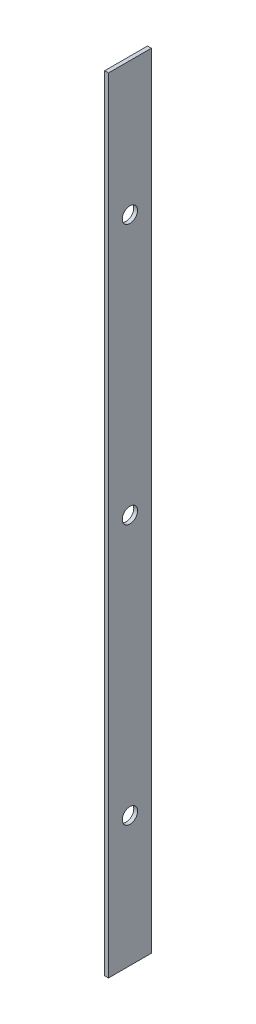
ISO-10303-21;
HEADER;
FILE_DESCRIPTION(('STEP AP214'),'2;1');
FILE_NAME('part.step','',(''),(''),'','','');
FILE_SCHEMA(('AUTOMOTIVE_DESIGN { 1 0 10303 214 1 1 1 1 }'));
ENDSEC;
DATA;
#1=APPLICATION_CONTEXT('core data for automotive mechanical design processes');
#2=APPLICATION_PROTOCOL_DEFINITION('international standard','automotive_design',2000,#1);
#3=PRODUCT_CONTEXT('',#1,'mechanical');
#4=PRODUCT('Part','Part','',(#3));
#5=PRODUCT_RELATED_PRODUCT_CATEGORY('part','',(#4));
#6=PRODUCT_DEFINITION_FORMATION('','',#4);
#7=PRODUCT_DEFINITION_CONTEXT('part definition',#1,'design');
#8=PRODUCT_DEFINITION('design','',#6,#7);
#9=PRODUCT_DEFINITION_SHAPE('','',#8);
#10=(LENGTH_UNIT() NAMED_UNIT(*) SI_UNIT(.MILLI.,.METRE.));
#11=(NAMED_UNIT(*) PLANE_ANGLE_UNIT() SI_UNIT($,.RADIAN.));
#12=(NAMED_UNIT(*) SI_UNIT($,.STERADIAN.) SOLID_ANGLE_UNIT());
#13=UNCERTAINTY_MEASURE_WITH_UNIT(LENGTH_MEASURE(1.E-05),#10,'distance_accuracy_value','');
#14=(GEOMETRIC_REPRESENTATION_CONTEXT(3) GLOBAL_UNCERTAINTY_ASSIGNED_CONTEXT((#13)) GLOBAL_UNIT_ASSIGNED_CONTEXT((#10,
#11,#12)) REPRESENTATION_CONTEXT('',''));
#15=CARTESIAN_POINT('',(0.,0.,0.));
#16=DIRECTION('',(0.,0.,1.));
#17=DIRECTION('',(1.,0.,0.));
#18=AXIS2_PLACEMENT_3D('',#15,#16,#17);
#19=CARTESIAN_POINT('',(1.5,0.,0.));
#20=DIRECTION('',(1.,0.,0.));
#21=DIRECTION('',(0.,0.,-1.));
#22=AXIS2_PLACEMENT_3D('',#19,#20,#21);
#23=PLANE('',#22);
#24=CARTESIAN_POINT('',(1.5,-7.74604075699193,16.5365200797255));
#25=DIRECTION('',(1.,0.,0.));
#26=DIRECTION('',(0.,0.,-1.));
#27=AXIS2_PLACEMENT_3D('',#24,#25,#26);
#28=CIRCLE('',#27,3.);
#29=CARTESIAN_POINT('',(1.5,-7.74604075699193,13.5365200797255));
#30=VERTEX_POINT('',#29);
#31=EDGE_CURVE('E122',#30,#30,#28,.T.);
#32=ORIENTED_EDGE('',*,*,#31,.F.);
#33=EDGE_LOOP('',(#32));
#34=FACE_BOUND('',#33,.T.);
#35=DIRECTION('',(0.,-1.,0.));
#36=VECTOR('',#35,1.);
#37=CARTESIAN_POINT('',(1.5,145.963612461817,24.8935200797206));
#38=LINE('',#37,#36);
#39=CARTESIAN_POINT('',(1.5,145.963612461817,24.8935200797206));
#40=VERTEX_POINT('',#39);
#41=CARTESIAN_POINT('',(1.5,-160.146040756996,24.8935200797208));
#42=VERTEX_POINT('',#41);
#43=EDGE_CURVE('E92',#40,#42,#38,.T.);
#44=ORIENTED_EDGE('',*,*,#43,.T.);
#45=DIRECTION('',(0.,0.,-1.));
#46=VECTOR('',#45,1.);
#47=CARTESIAN_POINT('',(1.5,-160.146040756996,24.8935200797208));
#48=LINE('',#47,#46);
#49=CARTESIAN_POINT('',(1.5,-160.146040756996,8.17952007972079));
#50=VERTEX_POINT('',#49);
#51=EDGE_CURVE('E87',#42,#50,#48,.T.);
#52=ORIENTED_EDGE('',*,*,#51,.T.);
#53=DIRECTION('',(0.,1.,0.));
#54=VECTOR('',#53,1.);
#55=CARTESIAN_POINT('',(1.5,-160.146040756996,8.17952007972079));
#56=LINE('',#55,#54);
#57=CARTESIAN_POINT('',(1.5,145.963612461817,8.17952007972055));
#58=VERTEX_POINT('',#57);
#59=EDGE_CURVE('E90',#50,#58,#56,.T.);
#60=ORIENTED_EDGE('',*,*,#59,.T.);
#61=DIRECTION('',(0.,0.,1.));
#62=VECTOR('',#61,1.);
#63=CARTESIAN_POINT('',(1.5,145.963612461817,8.17952007972055));
#64=LINE('',#63,#62);
#65=EDGE_CURVE('E57',#58,#40,#64,.T.);
#66=ORIENTED_EDGE('',*,*,#65,.T.);
#67=EDGE_LOOP('',(#44,#52,#60,#66));
#68=FACE_BOUND('',#67,.T.);
#69=CARTESIAN_POINT('',(1.5,93.8539592430032,16.5365200797248));
#70=DIRECTION('',(1.,0.,0.));
#71=DIRECTION('',(0.,0.,-1.));
#72=AXIS2_PLACEMENT_3D('',#69,#70,#71);
#73=CIRCLE('',#72,3.);
#74=CARTESIAN_POINT('',(1.5,93.8539592430032,13.5365200797248));
#75=VERTEX_POINT('',#74);
#76=EDGE_CURVE('E107',#75,#75,#73,.T.);
#77=ORIENTED_EDGE('',*,*,#76,.F.);
#78=EDGE_LOOP('',(#77));
#79=FACE_BOUND('',#78,.T.);
#80=CARTESIAN_POINT('',(1.5,-109.346040756997,16.5365200797244));
#81=DIRECTION('',(1.,0.,0.));
#82=DIRECTION('',(0.,0.,-1.));
#83=AXIS2_PLACEMENT_3D('',#80,#81,#82);
#84=CIRCLE('',#83,3.);
#85=CARTESIAN_POINT('',(1.5,-109.346040756997,13.5365200797244));
#86=VERTEX_POINT('',#85);
#87=EDGE_CURVE('E128',#86,#86,#84,.T.);
#88=ORIENTED_EDGE('',*,*,#87,.F.);
#89=EDGE_LOOP('',(#88));
#90=FACE_BOUND('',#89,.T.);
#91=ADVANCED_FACE('F40',(#34,#68,#79,#90),#23,.T.);
#92=CARTESIAN_POINT('',(0.,0.,0.));
#93=DIRECTION('',(1.,0.,0.));
#94=DIRECTION('',(0.,0.,-1.));
#95=AXIS2_PLACEMENT_3D('',#92,#93,#94);
#96=PLANE('',#95);
#97=DIRECTION('',(0.,-1.,0.));
#98=VECTOR('',#97,1.);
#99=CARTESIAN_POINT('',(0.,145.963612461817,24.8935200797206));
#100=LINE('',#99,#98);
#101=CARTESIAN_POINT('',(0.,145.963612461817,24.8935200797206));
#102=VERTEX_POINT('',#101);
#103=CARTESIAN_POINT('',(0.,-160.146040756996,24.8935200797208));
#104=VERTEX_POINT('',#103);
#105=EDGE_CURVE('E104',#102,#104,#100,.T.);
#106=ORIENTED_EDGE('',*,*,#105,.F.);
#107=DIRECTION('',(0.,0.,1.));
#108=VECTOR('',#107,1.);
#109=CARTESIAN_POINT('',(0.,145.963612461817,8.17952007972055));
#110=LINE('',#109,#108);
#111=CARTESIAN_POINT('',(0.,145.963612461817,8.17952007972055));
#112=VERTEX_POINT('',#111);
#113=EDGE_CURVE('E80',#112,#102,#110,.T.);
#114=ORIENTED_EDGE('',*,*,#113,.F.);
#115=DIRECTION('',(0.,1.,0.));
#116=VECTOR('',#115,1.);
#117=CARTESIAN_POINT('',(0.,-160.146040756996,8.17952007972079));
#118=LINE('',#117,#116);
#119=CARTESIAN_POINT('',(0.,-160.146040756996,8.17952007972079));
#120=VERTEX_POINT('',#119);
#121=EDGE_CURVE('E74',#120,#112,#118,.T.);
#122=ORIENTED_EDGE('',*,*,#121,.F.);
#123=DIRECTION('',(0.,0.,-1.));
#124=VECTOR('',#123,1.);
#125=CARTESIAN_POINT('',(0.,-160.146040756996,24.8935200797208));
#126=LINE('',#125,#124);
#127=EDGE_CURVE('E96',#104,#120,#126,.T.);
#128=ORIENTED_EDGE('',*,*,#127,.F.);
#129=EDGE_LOOP('',(#106,#114,#122,#128));
#130=FACE_BOUND('',#129,.T.);
#131=CARTESIAN_POINT('',(0.,93.8539592430032,16.5365200797248));
#132=DIRECTION('',(1.,0.,0.));
#133=DIRECTION('',(0.,0.,-1.));
#134=AXIS2_PLACEMENT_3D('',#131,#132,#133);
#135=CIRCLE('',#134,3.);
#136=CARTESIAN_POINT('',(0.,93.8539592430032,13.5365200797248));
#137=VERTEX_POINT('',#136);
#138=EDGE_CURVE('E119',#137,#137,#135,.T.);
#139=ORIENTED_EDGE('',*,*,#138,.T.);
#140=EDGE_LOOP('',(#139));
#141=FACE_BOUND('',#140,.T.);
#142=CARTESIAN_POINT('',(0.,-7.74604075699193,16.5365200797255));
#143=DIRECTION('',(1.,0.,0.));
#144=DIRECTION('',(0.,0.,-1.));
#145=AXIS2_PLACEMENT_3D('',#142,#143,#144);
#146=CIRCLE('',#145,3.);
#147=CARTESIAN_POINT('',(0.,-7.74604075699193,13.5365200797255));
#148=VERTEX_POINT('',#147);
#149=EDGE_CURVE('E125',#148,#148,#146,.T.);
#150=ORIENTED_EDGE('',*,*,#149,.T.);
#151=EDGE_LOOP('',(#150));
#152=FACE_BOUND('',#151,.T.);
#153=CARTESIAN_POINT('',(0.,-109.346040756997,16.5365200797244));
#154=DIRECTION('',(1.,0.,0.));
#155=DIRECTION('',(0.,0.,-1.));
#156=AXIS2_PLACEMENT_3D('',#153,#154,#155);
#157=CIRCLE('',#156,3.);
#158=CARTESIAN_POINT('',(0.,-109.346040756997,13.5365200797244));
#159=VERTEX_POINT('',#158);
#160=EDGE_CURVE('E131',#159,#159,#157,.T.);
#161=ORIENTED_EDGE('',*,*,#160,.T.);
#162=EDGE_LOOP('',(#161));
#163=FACE_BOUND('',#162,.T.);
#164=ADVANCED_FACE('F115',(#130,#141,#152,#163),#96,.F.);
#165=CARTESIAN_POINT('',(1.5,145.963612461817,24.8935200797206));
#166=DIRECTION('',(0.,0.,-1.));
#167=DIRECTION('',(0.,1.,0.));
#168=AXIS2_PLACEMENT_3D('',#165,#166,#167);
#169=PLANE('',#168);
#170=ORIENTED_EDGE('',*,*,#105,.T.);
#171=DIRECTION('',(-1.,0.,0.));
#172=VECTOR('',#171,1.);
#173=CARTESIAN_POINT('',(1.5,-160.146040756996,24.8935200797208));
#174=LINE('',#173,#172);
#175=EDGE_CURVE('E11',#42,#104,#174,.T.);
#176=ORIENTED_EDGE('',*,*,#175,.F.);
#177=ORIENTED_EDGE('',*,*,#43,.F.);
#178=DIRECTION('',(-1.,0.,0.));
#179=VECTOR('',#178,1.);
#180=CARTESIAN_POINT('',(1.5,145.963612461817,24.8935200797206));
#181=LINE('',#180,#179);
#182=EDGE_CURVE('E100',#40,#102,#181,.T.);
#183=ORIENTED_EDGE('',*,*,#182,.T.);
#184=EDGE_LOOP('',(#170,#176,#177,#183));
#185=FACE_BOUND('',#184,.T.);
#186=ADVANCED_FACE('F42',(#185),#169,.F.);
#187=CARTESIAN_POINT('',(1.5,-160.146040756996,24.8935200797208));
#188=DIRECTION('',(0.,1.,0.));
#189=DIRECTION('',(0.,0.,1.));
#190=AXIS2_PLACEMENT_3D('',#187,#188,#189);
#191=PLANE('',#190);
#192=ORIENTED_EDGE('',*,*,#127,.T.);
#193=DIRECTION('',(-1.,0.,0.));
#194=VECTOR('',#193,1.);
#195=CARTESIAN_POINT('',(1.5,-160.146040756996,8.17952007972079));
#196=LINE('',#195,#194);
#197=EDGE_CURVE('E49',#50,#120,#196,.T.);
#198=ORIENTED_EDGE('',*,*,#197,.F.);
#199=ORIENTED_EDGE('',*,*,#51,.F.);
#200=ORIENTED_EDGE('',*,*,#175,.T.);
#201=EDGE_LOOP('',(#192,#198,#199,#200));
#202=FACE_BOUND('',#201,.T.);
#203=ADVANCED_FACE('F95',(#202),#191,.F.);
#204=CARTESIAN_POINT('',(1.5,-160.146040756996,8.17952007972079));
#205=DIRECTION('',(0.,0.,1.));
#206=DIRECTION('',(0.,-1.,0.));
#207=AXIS2_PLACEMENT_3D('',#204,#205,#206);
#208=PLANE('',#207);
#209=ORIENTED_EDGE('',*,*,#121,.T.);
#210=DIRECTION('',(-1.,0.,0.));
#211=VECTOR('',#210,1.);
#212=CARTESIAN_POINT('',(1.5,145.963612461817,8.17952007972055));
#213=LINE('',#212,#211);
#214=EDGE_CURVE('E97',#58,#112,#213,.T.);
#215=ORIENTED_EDGE('',*,*,#214,.F.);
#216=ORIENTED_EDGE('',*,*,#59,.F.);
#217=ORIENTED_EDGE('',*,*,#197,.T.);
#218=EDGE_LOOP('',(#209,#215,#216,#217));
#219=FACE_BOUND('',#218,.T.);
#220=ADVANCED_FACE('F98',(#219),#208,.F.);
#221=CARTESIAN_POINT('',(1.5,145.963612461817,8.17952007972055));
#222=DIRECTION('',(0.,-1.,0.));
#223=DIRECTION('',(0.,0.,-1.));
#224=AXIS2_PLACEMENT_3D('',#221,#222,#223);
#225=PLANE('',#224);
#226=ORIENTED_EDGE('',*,*,#113,.T.);
#227=ORIENTED_EDGE('',*,*,#182,.F.);
#228=ORIENTED_EDGE('',*,*,#65,.F.);
#229=ORIENTED_EDGE('',*,*,#214,.T.);
#230=EDGE_LOOP('',(#226,#227,#228,#229));
#231=FACE_BOUND('',#230,.T.);
#232=ADVANCED_FACE('F112',(#231),#225,.F.);
#233=CARTESIAN_POINT('',(1.5,93.8539592430032,16.5365200797248));
#234=DIRECTION('',(-1.,0.,0.));
#235=DIRECTION('',(0.,0.,1.));
#236=AXIS2_PLACEMENT_3D('',#233,#234,#235);
#237=CYLINDRICAL_SURFACE('',#236,3.);
#238=ORIENTED_EDGE('',*,*,#76,.T.);
#239=EDGE_LOOP('',(#238));
#240=FACE_BOUND('',#239,.T.);
#241=ORIENTED_EDGE('',*,*,#138,.F.);
#242=EDGE_LOOP('',(#241));
#243=FACE_BOUND('',#242,.T.);
#244=ADVANCED_FACE('F149',(#240,#243),#237,.F.);
#245=CARTESIAN_POINT('',(1.5,-7.74604075699193,16.5365200797255));
#246=DIRECTION('',(-1.,0.,0.));
#247=DIRECTION('',(0.,0.,1.));
#248=AXIS2_PLACEMENT_3D('',#245,#246,#247);
#249=CYLINDRICAL_SURFACE('',#248,3.);
#250=ORIENTED_EDGE('',*,*,#31,.T.);
#251=EDGE_LOOP('',(#250));
#252=FACE_BOUND('',#251,.T.);
#253=ORIENTED_EDGE('',*,*,#149,.F.);
#254=EDGE_LOOP('',(#253));
#255=FACE_BOUND('',#254,.T.);
#256=ADVANCED_FACE('F194',(#252,#255),#249,.F.);
#257=CARTESIAN_POINT('',(1.5,-109.346040756997,16.5365200797244));
#258=DIRECTION('',(-1.,0.,0.));
#259=DIRECTION('',(0.,0.,1.));
#260=AXIS2_PLACEMENT_3D('',#257,#258,#259);
#261=CYLINDRICAL_SURFACE('',#260,3.);
#262=ORIENTED_EDGE('',*,*,#87,.T.);
#263=EDGE_LOOP('',(#262));
#264=FACE_BOUND('',#263,.T.);
#265=ORIENTED_EDGE('',*,*,#160,.F.);
#266=EDGE_LOOP('',(#265));
#267=FACE_BOUND('',#266,.T.);
#268=ADVANCED_FACE('F137',(#264,#267),#261,.F.);
#269=CLOSED_SHELL('',(#91,#164,#186,#203,#220,#232,#244,#256,#268));
#270=MANIFOLD_SOLID_BREP('B2',#269);
#271=ADVANCED_BREP_SHAPE_REPRESENTATION('',(#18,#270),#14);
#272=SHAPE_DEFINITION_REPRESENTATION(#9,#271);
ENDSEC;
END-ISO-10303-21;
